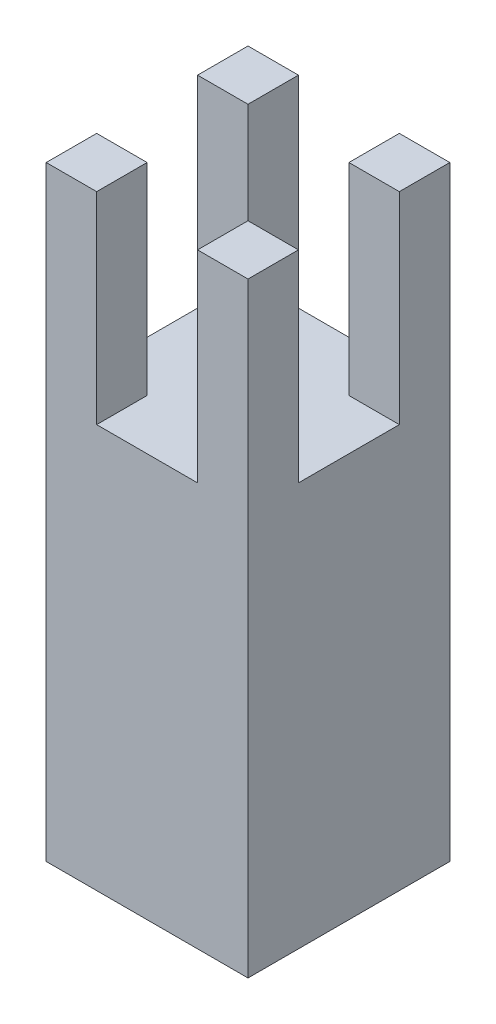
ISO-10303-21;
HEADER;
FILE_DESCRIPTION(('STEP AP214'),'2;1');
FILE_NAME('part.step','',(''),(''),'','','');
FILE_SCHEMA(('AUTOMOTIVE_DESIGN { 1 0 10303 214 1 1 1 1 }'));
ENDSEC;
DATA;
#1=APPLICATION_CONTEXT('core data for automotive mechanical design processes');
#2=APPLICATION_PROTOCOL_DEFINITION('international standard','automotive_design',2000,#1);
#3=PRODUCT_CONTEXT('',#1,'mechanical');
#4=PRODUCT('Part','Part','',(#3));
#5=PRODUCT_RELATED_PRODUCT_CATEGORY('part','',(#4));
#6=PRODUCT_DEFINITION_FORMATION('','',#4);
#7=PRODUCT_DEFINITION_CONTEXT('part definition',#1,'design');
#8=PRODUCT_DEFINITION('design','',#6,#7);
#9=PRODUCT_DEFINITION_SHAPE('','',#8);
#10=(LENGTH_UNIT() NAMED_UNIT(*) SI_UNIT(.MILLI.,.METRE.));
#11=(NAMED_UNIT(*) PLANE_ANGLE_UNIT() SI_UNIT($,.RADIAN.));
#12=(NAMED_UNIT(*) SI_UNIT($,.STERADIAN.) SOLID_ANGLE_UNIT());
#13=UNCERTAINTY_MEASURE_WITH_UNIT(LENGTH_MEASURE(1.E-05),#10,'distance_accuracy_value','');
#14=(GEOMETRIC_REPRESENTATION_CONTEXT(3) GLOBAL_UNCERTAINTY_ASSIGNED_CONTEXT((#13)) GLOBAL_UNIT_ASSIGNED_CONTEXT((#10,
#11,#12)) REPRESENTATION_CONTEXT('',''));
#15=CARTESIAN_POINT('',(0.,0.,0.));
#16=DIRECTION('',(0.,0.,1.));
#17=DIRECTION('',(1.,0.,0.));
#18=AXIS2_PLACEMENT_3D('',#15,#16,#17);
#19=CARTESIAN_POINT('',(50.8,304.8,50.8));
#20=DIRECTION('',(-1.,0.,0.));
#21=DIRECTION('',(0.,0.,1.));
#22=AXIS2_PLACEMENT_3D('',#19,#20,#21);
#23=PLANE('',#22);
#24=DIRECTION('',(0.,1.,0.));
#25=VECTOR('',#24,1.);
#26=CARTESIAN_POINT('',(50.8,203.2,-25.4));
#27=LINE('',#26,#25);
#28=CARTESIAN_POINT('',(50.8,203.2,-25.4));
#29=VERTEX_POINT('',#28);
#30=CARTESIAN_POINT('',(50.8,304.8,-25.4));
#31=VERTEX_POINT('',#30);
#32=EDGE_CURVE('E268',#29,#31,#27,.T.);
#33=ORIENTED_EDGE('',*,*,#32,.F.);
#34=DIRECTION('',(0.,0.,-1.));
#35=VECTOR('',#34,1.);
#36=CARTESIAN_POINT('',(50.8,203.2,0.));
#37=LINE('',#36,#35);
#38=CARTESIAN_POINT('',(50.8,203.2,25.4));
#39=VERTEX_POINT('',#38);
#40=EDGE_CURVE('E222',#39,#29,#37,.T.);
#41=ORIENTED_EDGE('',*,*,#40,.F.);
#42=DIRECTION('',(0.,1.,0.));
#43=VECTOR('',#42,1.);
#44=CARTESIAN_POINT('',(50.8,203.2,25.4));
#45=LINE('',#44,#43);
#46=CARTESIAN_POINT('',(50.8,304.8,25.4));
#47=VERTEX_POINT('',#46);
#48=EDGE_CURVE('E212',#39,#47,#45,.T.);
#49=ORIENTED_EDGE('',*,*,#48,.T.);
#50=DIRECTION('',(0.,0.,-1.));
#51=VECTOR('',#50,1.);
#52=CARTESIAN_POINT('',(50.8,304.8,50.8));
#53=LINE('',#52,#51);
#54=CARTESIAN_POINT('',(50.8,304.8,50.8));
#55=VERTEX_POINT('',#54);
#56=EDGE_CURVE('E294',#55,#47,#53,.T.);
#57=ORIENTED_EDGE('',*,*,#56,.F.);
#58=DIRECTION('',(0.,-1.,0.));
#59=VECTOR('',#58,1.);
#60=CARTESIAN_POINT('',(50.8,304.8,50.8));
#61=LINE('',#60,#59);
#62=CARTESIAN_POINT('',(50.8,0.,50.8));
#63=VERTEX_POINT('',#62);
#64=EDGE_CURVE('E306',#55,#63,#61,.T.);
#65=ORIENTED_EDGE('',*,*,#64,.T.);
#66=DIRECTION('',(0.,0.,-1.));
#67=VECTOR('',#66,1.);
#68=CARTESIAN_POINT('',(50.8,0.,50.8));
#69=LINE('',#68,#67);
#70=CARTESIAN_POINT('',(50.8,0.,-50.8));
#71=VERTEX_POINT('',#70);
#72=EDGE_CURVE('E293',#63,#71,#69,.T.);
#73=ORIENTED_EDGE('',*,*,#72,.T.);
#74=DIRECTION('',(0.,-1.,0.));
#75=VECTOR('',#74,1.);
#76=CARTESIAN_POINT('',(50.8,304.8,-50.8));
#77=LINE('',#76,#75);
#78=CARTESIAN_POINT('',(50.8,304.8,-50.8));
#79=VERTEX_POINT('',#78);
#80=EDGE_CURVE('E12',#79,#71,#77,.T.);
#81=ORIENTED_EDGE('',*,*,#80,.F.);
#82=EDGE_CURVE('E132',#31,#79,#53,.T.);
#83=ORIENTED_EDGE('',*,*,#82,.F.);
#84=EDGE_LOOP('',(#33,#41,#49,#57,#65,#73,#81,#83));
#85=FACE_BOUND('',#84,.T.);
#86=ADVANCED_FACE('F79',(#85),#23,.F.);
#87=CARTESIAN_POINT('',(0.,304.8,0.));
#88=DIRECTION('',(0.,-1.,0.));
#89=DIRECTION('',(0.,0.,-1.));
#90=AXIS2_PLACEMENT_3D('',#87,#88,#89);
#91=PLANE('',#90);
#92=DIRECTION('',(1.,0.,0.));
#93=VECTOR('',#92,1.);
#94=CARTESIAN_POINT('',(0.,304.8,-25.4));
#95=LINE('',#94,#93);
#96=CARTESIAN_POINT('',(25.4,304.8,-25.4));
#97=VERTEX_POINT('',#96);
#98=EDGE_CURVE('E251',#97,#31,#95,.T.);
#99=ORIENTED_EDGE('',*,*,#98,.T.);
#100=ORIENTED_EDGE('',*,*,#82,.T.);
#101=DIRECTION('',(-1.,0.,0.));
#102=VECTOR('',#101,1.);
#103=CARTESIAN_POINT('',(-50.8,304.8,-50.8));
#104=LINE('',#103,#102);
#105=CARTESIAN_POINT('',(25.4,304.8,-50.8));
#106=VERTEX_POINT('',#105);
#107=EDGE_CURVE('E297',#79,#106,#104,.T.);
#108=ORIENTED_EDGE('',*,*,#107,.T.);
#109=DIRECTION('',(0.,0.,-1.));
#110=VECTOR('',#109,1.);
#111=CARTESIAN_POINT('',(25.4,304.8,0.));
#112=LINE('',#111,#110);
#113=EDGE_CURVE('E253',#97,#106,#112,.T.);
#114=ORIENTED_EDGE('',*,*,#113,.F.);
#115=EDGE_LOOP('',(#99,#100,#108,#114));
#116=FACE_BOUND('',#115,.T.);
#117=ADVANCED_FACE('F345',(#116),#91,.F.);
#118=DIRECTION('',(0.,0.,-1.));
#119=VECTOR('',#118,1.);
#120=CARTESIAN_POINT('',(-25.4,304.8,0.));
#121=LINE('',#120,#119);
#122=CARTESIAN_POINT('',(-25.4,304.8,50.8));
#123=VERTEX_POINT('',#122);
#124=CARTESIAN_POINT('',(-25.4,304.8,25.4));
#125=VERTEX_POINT('',#124);
#126=EDGE_CURVE('E228',#123,#125,#121,.T.);
#127=ORIENTED_EDGE('',*,*,#126,.T.);
#128=DIRECTION('',(1.,0.,0.));
#129=VECTOR('',#128,1.);
#130=CARTESIAN_POINT('',(-50.8,304.8,25.4));
#131=LINE('',#130,#129);
#132=CARTESIAN_POINT('',(-50.8,304.8,25.4));
#133=VERTEX_POINT('',#132);
#134=EDGE_CURVE('E282',#133,#125,#131,.T.);
#135=ORIENTED_EDGE('',*,*,#134,.F.);
#136=DIRECTION('',(0.,0.,1.));
#137=VECTOR('',#136,1.);
#138=CARTESIAN_POINT('',(-50.8,304.8,50.8));
#139=LINE('',#138,#137);
#140=CARTESIAN_POINT('',(-50.8,304.8,50.8));
#141=VERTEX_POINT('',#140);
#142=EDGE_CURVE('E299',#133,#141,#139,.T.);
#143=ORIENTED_EDGE('',*,*,#142,.T.);
#144=DIRECTION('',(1.,0.,0.));
#145=VECTOR('',#144,1.);
#146=CARTESIAN_POINT('',(-50.8,304.8,50.8));
#147=LINE('',#146,#145);
#148=EDGE_CURVE('E303',#141,#123,#147,.T.);
#149=ORIENTED_EDGE('',*,*,#148,.T.);
#150=EDGE_LOOP('',(#127,#135,#143,#149));
#151=FACE_BOUND('',#150,.T.);
#152=ADVANCED_FACE('F364',(#151),#91,.F.);
#153=CARTESIAN_POINT('',(-25.4,304.8,-25.4));
#154=VERTEX_POINT('',#153);
#155=CARTESIAN_POINT('',(-25.4,304.8,-50.8));
#156=VERTEX_POINT('',#155);
#157=EDGE_CURVE('E93',#154,#156,#121,.T.);
#158=ORIENTED_EDGE('',*,*,#157,.T.);
#159=CARTESIAN_POINT('',(-50.8,304.8,-50.8));
#160=VERTEX_POINT('',#159);
#161=EDGE_CURVE('E296',#156,#160,#104,.T.);
#162=ORIENTED_EDGE('',*,*,#161,.T.);
#163=CARTESIAN_POINT('',(-50.8,304.8,-25.4));
#164=VERTEX_POINT('',#163);
#165=EDGE_CURVE('E300',#160,#164,#139,.T.);
#166=ORIENTED_EDGE('',*,*,#165,.T.);
#167=DIRECTION('',(1.,0.,0.));
#168=VECTOR('',#167,1.);
#169=CARTESIAN_POINT('',(-50.8,304.8,-25.4));
#170=LINE('',#169,#168);
#171=EDGE_CURVE('E275',#164,#154,#170,.T.);
#172=ORIENTED_EDGE('',*,*,#171,.T.);
#173=EDGE_LOOP('',(#158,#162,#166,#172));
#174=FACE_BOUND('',#173,.T.);
#175=ADVANCED_FACE('F369',(#174),#91,.F.);
#176=CARTESIAN_POINT('',(-50.8,304.8,-50.8));
#177=DIRECTION('',(0.,0.,1.));
#178=DIRECTION('',(1.,0.,0.));
#179=AXIS2_PLACEMENT_3D('',#176,#177,#178);
#180=PLANE('',#179);
#181=DIRECTION('',(-1.,0.,0.));
#182=VECTOR('',#181,1.);
#183=CARTESIAN_POINT('',(0.,203.2,-50.8));
#184=LINE('',#183,#182);
#185=CARTESIAN_POINT('',(25.4,203.2,-50.8));
#186=VERTEX_POINT('',#185);
#187=CARTESIAN_POINT('',(-25.4,203.2,-50.8));
#188=VERTEX_POINT('',#187);
#189=EDGE_CURVE('E239',#186,#188,#184,.T.);
#190=ORIENTED_EDGE('',*,*,#189,.F.);
#191=DIRECTION('',(0.,1.,0.));
#192=VECTOR('',#191,1.);
#193=CARTESIAN_POINT('',(25.4,203.2,-50.8));
#194=LINE('',#193,#192);
#195=EDGE_CURVE('E263',#186,#106,#194,.T.);
#196=ORIENTED_EDGE('',*,*,#195,.T.);
#197=ORIENTED_EDGE('',*,*,#107,.F.);
#198=ORIENTED_EDGE('',*,*,#80,.T.);
#199=DIRECTION('',(-1.,0.,0.));
#200=VECTOR('',#199,1.);
#201=CARTESIAN_POINT('',(-50.8,0.,-50.8));
#202=LINE('',#201,#200);
#203=CARTESIAN_POINT('',(-50.8,0.,-50.8));
#204=VERTEX_POINT('',#203);
#205=EDGE_CURVE('E309',#71,#204,#202,.T.);
#206=ORIENTED_EDGE('',*,*,#205,.T.);
#207=DIRECTION('',(0.,-1.,0.));
#208=VECTOR('',#207,1.);
#209=CARTESIAN_POINT('',(-50.8,304.8,-50.8));
#210=LINE('',#209,#208);
#211=EDGE_CURVE('E86',#160,#204,#210,.T.);
#212=ORIENTED_EDGE('',*,*,#211,.F.);
#213=ORIENTED_EDGE('',*,*,#161,.F.);
#214=DIRECTION('',(0.,1.,0.));
#215=VECTOR('',#214,1.);
#216=CARTESIAN_POINT('',(-25.4,203.2,-50.8));
#217=LINE('',#216,#215);
#218=EDGE_CURVE('E261',#188,#156,#217,.T.);
#219=ORIENTED_EDGE('',*,*,#218,.F.);
#220=EDGE_LOOP('',(#190,#196,#197,#198,#206,#212,#213,#219));
#221=FACE_BOUND('',#220,.T.);
#222=ADVANCED_FACE('F343',(#221),#180,.F.);
#223=CARTESIAN_POINT('',(-50.8,304.8,50.8));
#224=DIRECTION('',(1.,0.,0.));
#225=DIRECTION('',(0.,0.,-1.));
#226=AXIS2_PLACEMENT_3D('',#223,#224,#225);
#227=PLANE('',#226);
#228=ORIENTED_EDGE('',*,*,#142,.F.);
#229=DIRECTION('',(0.,1.,0.));
#230=VECTOR('',#229,1.);
#231=CARTESIAN_POINT('',(-50.8,203.2,25.4));
#232=LINE('',#231,#230);
#233=CARTESIAN_POINT('',(-50.8,203.2,25.4));
#234=VERTEX_POINT('',#233);
#235=EDGE_CURVE('E249',#234,#133,#232,.T.);
#236=ORIENTED_EDGE('',*,*,#235,.F.);
#237=DIRECTION('',(0.,0.,-1.));
#238=VECTOR('',#237,1.);
#239=CARTESIAN_POINT('',(-50.8,203.2,25.4));
#240=LINE('',#239,#238);
#241=CARTESIAN_POINT('',(-50.8,203.2,-25.4));
#242=VERTEX_POINT('',#241);
#243=EDGE_CURVE('E278',#234,#242,#240,.T.);
#244=ORIENTED_EDGE('',*,*,#243,.T.);
#245=DIRECTION('',(0.,1.,0.));
#246=VECTOR('',#245,1.);
#247=CARTESIAN_POINT('',(-50.8,203.2,-25.4));
#248=LINE('',#247,#246);
#249=EDGE_CURVE('E281',#242,#164,#248,.T.);
#250=ORIENTED_EDGE('',*,*,#249,.T.);
#251=ORIENTED_EDGE('',*,*,#165,.F.);
#252=ORIENTED_EDGE('',*,*,#211,.T.);
#253=DIRECTION('',(0.,0.,1.));
#254=VECTOR('',#253,1.);
#255=CARTESIAN_POINT('',(-50.8,0.,50.8));
#256=LINE('',#255,#254);
#257=CARTESIAN_POINT('',(-50.8,0.,50.8));
#258=VERTEX_POINT('',#257);
#259=EDGE_CURVE('E311',#204,#258,#256,.T.);
#260=ORIENTED_EDGE('',*,*,#259,.T.);
#261=DIRECTION('',(0.,-1.,0.));
#262=VECTOR('',#261,1.);
#263=CARTESIAN_POINT('',(-50.8,304.8,50.8));
#264=LINE('',#263,#262);
#265=EDGE_CURVE('E315',#141,#258,#264,.T.);
#266=ORIENTED_EDGE('',*,*,#265,.F.);
#267=EDGE_LOOP('',(#228,#236,#244,#250,#251,#252,#260,#266));
#268=FACE_BOUND('',#267,.T.);
#269=ADVANCED_FACE('F322',(#268),#227,.F.);
#270=CARTESIAN_POINT('',(-50.8,304.8,50.8));
#271=DIRECTION('',(0.,0.,-1.));
#272=DIRECTION('',(-1.,0.,0.));
#273=AXIS2_PLACEMENT_3D('',#270,#271,#272);
#274=PLANE('',#273);
#275=CARTESIAN_POINT('',(25.4,304.8,50.8));
#276=VERTEX_POINT('',#275);
#277=EDGE_CURVE('E102',#276,#55,#147,.T.);
#278=ORIENTED_EDGE('',*,*,#277,.F.);
#279=DIRECTION('',(0.,1.,0.));
#280=VECTOR('',#279,1.);
#281=CARTESIAN_POINT('',(25.4,203.2,50.8));
#282=LINE('',#281,#280);
#283=CARTESIAN_POINT('',(25.4,203.2,50.8));
#284=VERTEX_POINT('',#283);
#285=EDGE_CURVE('E255',#284,#276,#282,.T.);
#286=ORIENTED_EDGE('',*,*,#285,.F.);
#287=DIRECTION('',(1.,0.,0.));
#288=VECTOR('',#287,1.);
#289=CARTESIAN_POINT('',(0.,203.2,50.8));
#290=LINE('',#289,#288);
#291=CARTESIAN_POINT('',(-25.4,203.2,50.8));
#292=VERTEX_POINT('',#291);
#293=EDGE_CURVE('E213',#292,#284,#290,.T.);
#294=ORIENTED_EDGE('',*,*,#293,.F.);
#295=DIRECTION('',(0.,1.,0.));
#296=VECTOR('',#295,1.);
#297=CARTESIAN_POINT('',(-25.4,203.2,50.8));
#298=LINE('',#297,#296);
#299=EDGE_CURVE('E258',#292,#123,#298,.T.);
#300=ORIENTED_EDGE('',*,*,#299,.T.);
#301=ORIENTED_EDGE('',*,*,#148,.F.);
#302=ORIENTED_EDGE('',*,*,#265,.T.);
#303=DIRECTION('',(1.,0.,0.));
#304=VECTOR('',#303,1.);
#305=CARTESIAN_POINT('',(-50.8,0.,50.8));
#306=LINE('',#305,#304);
#307=EDGE_CURVE('E124',#258,#63,#306,.T.);
#308=ORIENTED_EDGE('',*,*,#307,.T.);
#309=ORIENTED_EDGE('',*,*,#64,.F.);
#310=EDGE_LOOP('',(#278,#286,#294,#300,#301,#302,#308,#309));
#311=FACE_BOUND('',#310,.T.);
#312=ADVANCED_FACE('F333',(#311),#274,.F.);
#313=ORIENTED_EDGE('',*,*,#56,.T.);
#314=DIRECTION('',(1.,0.,0.));
#315=VECTOR('',#314,1.);
#316=CARTESIAN_POINT('',(0.,304.8,25.4));
#317=LINE('',#316,#315);
#318=CARTESIAN_POINT('',(25.4,304.8,25.4));
#319=VERTEX_POINT('',#318);
#320=EDGE_CURVE('E248',#319,#47,#317,.T.);
#321=ORIENTED_EDGE('',*,*,#320,.F.);
#322=DIRECTION('',(0.,0.,-1.));
#323=VECTOR('',#322,1.);
#324=CARTESIAN_POINT('',(25.4,304.8,0.));
#325=LINE('',#324,#323);
#326=EDGE_CURVE('E209',#276,#319,#325,.T.);
#327=ORIENTED_EDGE('',*,*,#326,.F.);
#328=ORIENTED_EDGE('',*,*,#277,.T.);
#329=EDGE_LOOP('',(#313,#321,#327,#328));
#330=FACE_BOUND('',#329,.T.);
#331=ADVANCED_FACE('F334',(#330),#91,.F.);
#332=CARTESIAN_POINT('',(0.,0.,0.));
#333=DIRECTION('',(0.,-1.,0.));
#334=DIRECTION('',(0.,0.,-1.));
#335=AXIS2_PLACEMENT_3D('',#332,#333,#334);
#336=PLANE('',#335);
#337=ORIENTED_EDGE('',*,*,#72,.F.);
#338=ORIENTED_EDGE('',*,*,#307,.F.);
#339=ORIENTED_EDGE('',*,*,#259,.F.);
#340=ORIENTED_EDGE('',*,*,#205,.F.);
#341=EDGE_LOOP('',(#337,#338,#339,#340));
#342=FACE_BOUND('',#341,.T.);
#343=ADVANCED_FACE('F328',(#342),#336,.T.);
#344=CARTESIAN_POINT('',(0.,203.2,-25.4));
#345=DIRECTION('',(0.,0.,1.));
#346=DIRECTION('',(1.,0.,0.));
#347=AXIS2_PLACEMENT_3D('',#344,#345,#346);
#348=PLANE('',#347);
#349=ORIENTED_EDGE('',*,*,#98,.F.);
#350=DIRECTION('',(0.,1.,0.));
#351=VECTOR('',#350,1.);
#352=CARTESIAN_POINT('',(25.4,203.2,-25.4));
#353=LINE('',#352,#351);
#354=CARTESIAN_POINT('',(25.4,203.2,-25.4));
#355=VERTEX_POINT('',#354);
#356=EDGE_CURVE('E266',#355,#97,#353,.T.);
#357=ORIENTED_EDGE('',*,*,#356,.F.);
#358=DIRECTION('',(1.,0.,0.));
#359=VECTOR('',#358,1.);
#360=CARTESIAN_POINT('',(0.,203.2,-25.4));
#361=LINE('',#360,#359);
#362=EDGE_CURVE('E234',#355,#29,#361,.T.);
#363=ORIENTED_EDGE('',*,*,#362,.T.);
#364=ORIENTED_EDGE('',*,*,#32,.T.);
#365=EDGE_LOOP('',(#349,#357,#363,#364));
#366=FACE_BOUND('',#365,.T.);
#367=ADVANCED_FACE('F346',(#366),#348,.T.);
#368=CARTESIAN_POINT('',(0.,203.2,25.4));
#369=DIRECTION('',(0.,0.,1.));
#370=DIRECTION('',(1.,0.,0.));
#371=AXIS2_PLACEMENT_3D('',#368,#369,#370);
#372=PLANE('',#371);
#373=ORIENTED_EDGE('',*,*,#320,.T.);
#374=ORIENTED_EDGE('',*,*,#48,.F.);
#375=DIRECTION('',(1.,0.,0.));
#376=VECTOR('',#375,1.);
#377=CARTESIAN_POINT('',(0.,203.2,25.4));
#378=LINE('',#377,#376);
#379=CARTESIAN_POINT('',(25.4,203.2,25.4));
#380=VERTEX_POINT('',#379);
#381=EDGE_CURVE('E216',#380,#39,#378,.T.);
#382=ORIENTED_EDGE('',*,*,#381,.F.);
#383=DIRECTION('',(0.,1.,0.));
#384=VECTOR('',#383,1.);
#385=CARTESIAN_POINT('',(25.4,203.2,25.4));
#386=LINE('',#385,#384);
#387=EDGE_CURVE('E203',#380,#319,#386,.T.);
#388=ORIENTED_EDGE('',*,*,#387,.T.);
#389=EDGE_LOOP('',(#373,#374,#382,#388));
#390=FACE_BOUND('',#389,.T.);
#391=ADVANCED_FACE('F217',(#390),#372,.F.);
#392=CARTESIAN_POINT('',(25.4,203.2,0.));
#393=DIRECTION('',(1.,0.,0.));
#394=DIRECTION('',(0.,0.,-1.));
#395=AXIS2_PLACEMENT_3D('',#392,#393,#394);
#396=PLANE('',#395);
#397=ORIENTED_EDGE('',*,*,#113,.T.);
#398=ORIENTED_EDGE('',*,*,#195,.F.);
#399=DIRECTION('',(0.,0.,-1.));
#400=VECTOR('',#399,1.);
#401=CARTESIAN_POINT('',(25.4,203.2,0.));
#402=LINE('',#401,#400);
#403=EDGE_CURVE('E236',#355,#186,#402,.T.);
#404=ORIENTED_EDGE('',*,*,#403,.F.);
#405=ORIENTED_EDGE('',*,*,#356,.T.);
#406=EDGE_LOOP('',(#397,#398,#404,#405));
#407=FACE_BOUND('',#406,.T.);
#408=ADVANCED_FACE('F340',(#407),#396,.F.);
#409=CARTESIAN_POINT('',(-25.4,203.2,0.));
#410=DIRECTION('',(1.,0.,0.));
#411=DIRECTION('',(0.,0.,-1.));
#412=AXIS2_PLACEMENT_3D('',#409,#410,#411);
#413=PLANE('',#412);
#414=DIRECTION('',(0.,-1.,0.));
#415=VECTOR('',#414,1.);
#416=CARTESIAN_POINT('',(-25.4,203.2,-25.4));
#417=LINE('',#416,#415);
#418=CARTESIAN_POINT('',(-25.4,203.2,-25.4));
#419=VERTEX_POINT('',#418);
#420=EDGE_CURVE('E257',#154,#419,#417,.T.);
#421=ORIENTED_EDGE('',*,*,#420,.T.);
#422=DIRECTION('',(0.,0.,-1.));
#423=VECTOR('',#422,1.);
#424=CARTESIAN_POINT('',(-25.4,203.2,0.));
#425=LINE('',#424,#423);
#426=EDGE_CURVE('E242',#419,#188,#425,.T.);
#427=ORIENTED_EDGE('',*,*,#426,.T.);
#428=ORIENTED_EDGE('',*,*,#218,.T.);
#429=ORIENTED_EDGE('',*,*,#157,.F.);
#430=EDGE_LOOP('',(#421,#427,#428,#429));
#431=FACE_BOUND('',#430,.T.);
#432=ADVANCED_FACE('F354',(#431),#413,.T.);
#433=CARTESIAN_POINT('',(25.4,203.2,0.));
#434=DIRECTION('',(1.,0.,0.));
#435=DIRECTION('',(0.,0.,-1.));
#436=AXIS2_PLACEMENT_3D('',#433,#434,#435);
#437=PLANE('',#436);
#438=ORIENTED_EDGE('',*,*,#326,.T.);
#439=ORIENTED_EDGE('',*,*,#387,.F.);
#440=DIRECTION('',(0.,0.,-1.));
#441=VECTOR('',#440,1.);
#442=CARTESIAN_POINT('',(25.4,203.2,0.));
#443=LINE('',#442,#441);
#444=EDGE_CURVE('E207',#284,#380,#443,.T.);
#445=ORIENTED_EDGE('',*,*,#444,.F.);
#446=ORIENTED_EDGE('',*,*,#285,.T.);
#447=EDGE_LOOP('',(#438,#439,#445,#446));
#448=FACE_BOUND('',#447,.T.);
#449=ADVANCED_FACE('F205',(#448),#437,.F.);
#450=ORIENTED_EDGE('',*,*,#126,.F.);
#451=ORIENTED_EDGE('',*,*,#299,.F.);
#452=CARTESIAN_POINT('',(-25.4,203.2,25.4));
#453=VERTEX_POINT('',#452);
#454=EDGE_CURVE('E243',#292,#453,#425,.T.);
#455=ORIENTED_EDGE('',*,*,#454,.T.);
#456=DIRECTION('',(0.,-1.,0.));
#457=VECTOR('',#456,1.);
#458=CARTESIAN_POINT('',(-25.4,203.2,25.4));
#459=LINE('',#458,#457);
#460=EDGE_CURVE('E291',#125,#453,#459,.T.);
#461=ORIENTED_EDGE('',*,*,#460,.F.);
#462=EDGE_LOOP('',(#450,#451,#455,#461));
#463=FACE_BOUND('',#462,.T.);
#464=ADVANCED_FACE('F392',(#463),#413,.T.);
#465=CARTESIAN_POINT('',(0.,203.2,0.));
#466=DIRECTION('',(0.,1.,0.));
#467=DIRECTION('',(0.,0.,1.));
#468=AXIS2_PLACEMENT_3D('',#465,#466,#467);
#469=PLANE('',#468);
#470=ORIENTED_EDGE('',*,*,#454,.F.);
#471=ORIENTED_EDGE('',*,*,#293,.T.);
#472=ORIENTED_EDGE('',*,*,#444,.T.);
#473=ORIENTED_EDGE('',*,*,#381,.T.);
#474=ORIENTED_EDGE('',*,*,#40,.T.);
#475=ORIENTED_EDGE('',*,*,#362,.F.);
#476=ORIENTED_EDGE('',*,*,#403,.T.);
#477=ORIENTED_EDGE('',*,*,#189,.T.);
#478=ORIENTED_EDGE('',*,*,#426,.F.);
#479=DIRECTION('',(1.,0.,0.));
#480=VECTOR('',#479,1.);
#481=CARTESIAN_POINT('',(-50.8,203.2,-25.4));
#482=LINE('',#481,#480);
#483=EDGE_CURVE('E274',#242,#419,#482,.T.);
#484=ORIENTED_EDGE('',*,*,#483,.F.);
#485=ORIENTED_EDGE('',*,*,#243,.F.);
#486=DIRECTION('',(1.,0.,0.));
#487=VECTOR('',#486,1.);
#488=CARTESIAN_POINT('',(-50.8,203.2,25.4));
#489=LINE('',#488,#487);
#490=EDGE_CURVE('E271',#234,#453,#489,.T.);
#491=ORIENTED_EDGE('',*,*,#490,.T.);
#492=EDGE_LOOP('',(#470,#471,#472,#473,#474,#475,#476,#477,#478,#484,#485,#491));
#493=FACE_BOUND('',#492,.T.);
#494=ADVANCED_FACE('F225',(#493),#469,.T.);
#495=CARTESIAN_POINT('',(-50.8,203.2,25.4));
#496=DIRECTION('',(0.,0.,1.));
#497=DIRECTION('',(1.,0.,0.));
#498=AXIS2_PLACEMENT_3D('',#495,#496,#497);
#499=PLANE('',#498);
#500=ORIENTED_EDGE('',*,*,#460,.T.);
#501=ORIENTED_EDGE('',*,*,#490,.F.);
#502=ORIENTED_EDGE('',*,*,#235,.T.);
#503=ORIENTED_EDGE('',*,*,#134,.T.);
#504=EDGE_LOOP('',(#500,#501,#502,#503));
#505=FACE_BOUND('',#504,.T.);
#506=ADVANCED_FACE('F389',(#505),#499,.F.);
#507=CARTESIAN_POINT('',(-50.8,203.2,-25.4));
#508=DIRECTION('',(0.,0.,1.));
#509=DIRECTION('',(1.,0.,0.));
#510=AXIS2_PLACEMENT_3D('',#507,#508,#509);
#511=PLANE('',#510);
#512=ORIENTED_EDGE('',*,*,#171,.F.);
#513=ORIENTED_EDGE('',*,*,#249,.F.);
#514=ORIENTED_EDGE('',*,*,#483,.T.);
#515=ORIENTED_EDGE('',*,*,#420,.F.);
#516=EDGE_LOOP('',(#512,#513,#514,#515));
#517=FACE_BOUND('',#516,.T.);
#518=ADVANCED_FACE('F433',(#517),#511,.T.);
#519=CLOSED_SHELL('',(#86,#117,#152,#175,#222,#269,#312,#331,#343,#367,#391,#408,#432,#449,#464,
#494,#506,#518));
#520=MANIFOLD_SOLID_BREP('B2',#519);
#521=ADVANCED_BREP_SHAPE_REPRESENTATION('',(#18,#520),#14);
#522=SHAPE_DEFINITION_REPRESENTATION(#9,#521);
ENDSEC;
END-ISO-10303-21;
